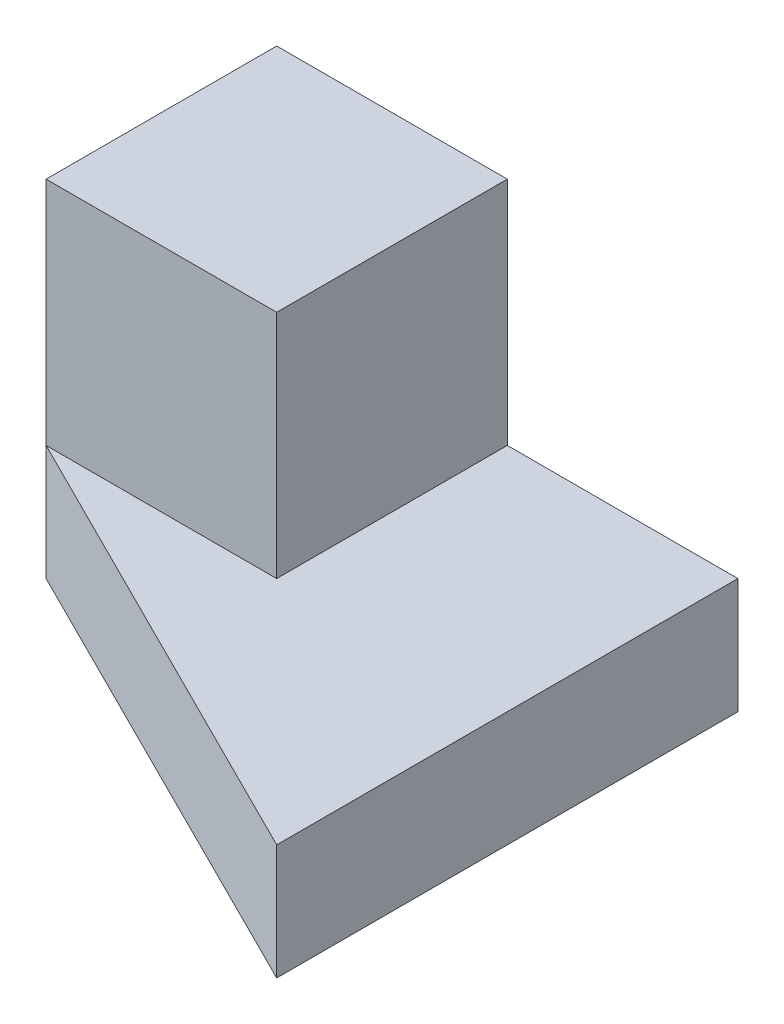
ISO-10303-21;
HEADER;
FILE_DESCRIPTION(('STEP AP214'),'2;1');
FILE_NAME('part.step','',(''),(''),'','','');
FILE_SCHEMA(('AUTOMOTIVE_DESIGN { 1 0 10303 214 1 1 1 1 }'));
ENDSEC;
DATA;
#1=APPLICATION_CONTEXT('core data for automotive mechanical design processes');
#2=APPLICATION_PROTOCOL_DEFINITION('international standard','automotive_design',2000,#1);
#3=PRODUCT_CONTEXT('',#1,'mechanical');
#4=PRODUCT('Part','Part','',(#3));
#5=PRODUCT_RELATED_PRODUCT_CATEGORY('part','',(#4));
#6=PRODUCT_DEFINITION_FORMATION('','',#4);
#7=PRODUCT_DEFINITION_CONTEXT('part definition',#1,'design');
#8=PRODUCT_DEFINITION('design','',#6,#7);
#9=PRODUCT_DEFINITION_SHAPE('','',#8);
#10=(LENGTH_UNIT() NAMED_UNIT(*) SI_UNIT(.MILLI.,.METRE.));
#11=(NAMED_UNIT(*) PLANE_ANGLE_UNIT() SI_UNIT($,.RADIAN.));
#12=(NAMED_UNIT(*) SI_UNIT($,.STERADIAN.) SOLID_ANGLE_UNIT());
#13=UNCERTAINTY_MEASURE_WITH_UNIT(LENGTH_MEASURE(1.E-05),#10,'distance_accuracy_value','');
#14=(GEOMETRIC_REPRESENTATION_CONTEXT(3) GLOBAL_UNCERTAINTY_ASSIGNED_CONTEXT((#13)) GLOBAL_UNIT_ASSIGNED_CONTEXT((#10,
#11,#12)) REPRESENTATION_CONTEXT('',''));
#15=CARTESIAN_POINT('',(0.,0.,0.));
#16=DIRECTION('',(0.,0.,1.));
#17=DIRECTION('',(1.,0.,0.));
#18=AXIS2_PLACEMENT_3D('',#15,#16,#17);
#19=CARTESIAN_POINT('',(0.,5.,0.));
#20=DIRECTION('',(1.,0.,0.));
#21=DIRECTION('',(0.,0.,-1.));
#22=AXIS2_PLACEMENT_3D('',#19,#20,#21);
#23=PLANE('',#22);
#24=DIRECTION('',(0.,0.,1.));
#25=VECTOR('',#24,1.);
#26=CARTESIAN_POINT('',(0.,0.,0.));
#27=LINE('',#26,#25);
#28=CARTESIAN_POINT('',(0.,0.,0.));
#29=VERTEX_POINT('',#28);
#30=CARTESIAN_POINT('',(0.,0.,10.));
#31=VERTEX_POINT('',#30);
#32=EDGE_CURVE('E117',#29,#31,#27,.T.);
#33=ORIENTED_EDGE('',*,*,#32,.T.);
#34=DIRECTION('',(0.,-1.,0.));
#35=VECTOR('',#34,1.);
#36=CARTESIAN_POINT('',(0.,5.,10.));
#37=LINE('',#36,#35);
#38=CARTESIAN_POINT('',(0.,5.,10.));
#39=VERTEX_POINT('',#38);
#40=EDGE_CURVE('E11',#39,#31,#37,.T.);
#41=ORIENTED_EDGE('',*,*,#40,.F.);
#42=DIRECTION('',(0.,-1.,0.));
#43=VECTOR('',#42,1.);
#44=CARTESIAN_POINT('',(0.,15.,10.));
#45=LINE('',#44,#43);
#46=CARTESIAN_POINT('',(0.,15.,10.));
#47=VERTEX_POINT('',#46);
#48=EDGE_CURVE('E99',#47,#39,#45,.T.);
#49=ORIENTED_EDGE('',*,*,#48,.F.);
#50=DIRECTION('',(0.,0.,1.));
#51=VECTOR('',#50,1.);
#52=CARTESIAN_POINT('',(0.,15.,0.));
#53=LINE('',#52,#51);
#54=CARTESIAN_POINT('',(0.,15.,0.));
#55=VERTEX_POINT('',#54);
#56=EDGE_CURVE('E105',#55,#47,#53,.T.);
#57=ORIENTED_EDGE('',*,*,#56,.F.);
#58=DIRECTION('',(0.,-1.,0.));
#59=VECTOR('',#58,1.);
#60=CARTESIAN_POINT('',(0.,5.,0.));
#61=LINE('',#60,#59);
#62=EDGE_CURVE('E128',#55,#29,#61,.T.);
#63=ORIENTED_EDGE('',*,*,#62,.T.);
#64=EDGE_LOOP('',(#33,#41,#49,#57,#63));
#65=FACE_BOUND('',#64,.T.);
#66=ADVANCED_FACE('F33',(#65),#23,.F.);
#67=CARTESIAN_POINT('',(0.,5.,10.));
#68=DIRECTION('',(0.447213595499958,0.,-0.894427190999916));
#69=DIRECTION('',(-0.894427190999916,0.,-0.447213595499958));
#70=AXIS2_PLACEMENT_3D('',#67,#68,#69);
#71=PLANE('',#70);
#72=DIRECTION('',(0.894427190999916,0.,0.447213595499958));
#73=VECTOR('',#72,1.);
#74=CARTESIAN_POINT('',(0.,0.,10.));
#75=LINE('',#74,#73);
#76=CARTESIAN_POINT('',(20.,0.,20.));
#77=VERTEX_POINT('',#76);
#78=EDGE_CURVE('E119',#31,#77,#75,.T.);
#79=ORIENTED_EDGE('',*,*,#78,.T.);
#80=DIRECTION('',(0.,-1.,0.));
#81=VECTOR('',#80,1.);
#82=CARTESIAN_POINT('',(20.,5.,20.));
#83=LINE('',#82,#81);
#84=CARTESIAN_POINT('',(20.,5.,20.));
#85=VERTEX_POINT('',#84);
#86=EDGE_CURVE('E40',#85,#77,#83,.T.);
#87=ORIENTED_EDGE('',*,*,#86,.F.);
#88=DIRECTION('',(0.894427190999916,0.,0.447213595499958));
#89=VECTOR('',#88,1.);
#90=CARTESIAN_POINT('',(0.,5.,10.));
#91=LINE('',#90,#89);
#92=EDGE_CURVE('E125',#39,#85,#91,.T.);
#93=ORIENTED_EDGE('',*,*,#92,.F.);
#94=ORIENTED_EDGE('',*,*,#40,.T.);
#95=EDGE_LOOP('',(#79,#87,#93,#94));
#96=FACE_BOUND('',#95,.T.);
#97=ADVANCED_FACE('F165',(#96),#71,.F.);
#98=CARTESIAN_POINT('',(20.,5.,0.));
#99=DIRECTION('',(-1.,0.,0.));
#100=DIRECTION('',(0.,0.,1.));
#101=AXIS2_PLACEMENT_3D('',#98,#99,#100);
#102=PLANE('',#101);
#103=DIRECTION('',(0.,0.,-1.));
#104=VECTOR('',#103,1.);
#105=CARTESIAN_POINT('',(20.,0.,0.));
#106=LINE('',#105,#104);
#107=CARTESIAN_POINT('',(20.,0.,0.));
#108=VERTEX_POINT('',#107);
#109=EDGE_CURVE('E131',#77,#108,#106,.T.);
#110=ORIENTED_EDGE('',*,*,#109,.T.);
#111=DIRECTION('',(0.,-1.,0.));
#112=VECTOR('',#111,1.);
#113=CARTESIAN_POINT('',(20.,5.,0.));
#114=LINE('',#113,#112);
#115=CARTESIAN_POINT('',(20.,5.,0.));
#116=VERTEX_POINT('',#115);
#117=EDGE_CURVE('E135',#116,#108,#114,.T.);
#118=ORIENTED_EDGE('',*,*,#117,.F.);
#119=DIRECTION('',(0.,0.,-1.));
#120=VECTOR('',#119,1.);
#121=CARTESIAN_POINT('',(20.,5.,0.));
#122=LINE('',#121,#120);
#123=EDGE_CURVE('E53',#85,#116,#122,.T.);
#124=ORIENTED_EDGE('',*,*,#123,.F.);
#125=ORIENTED_EDGE('',*,*,#86,.T.);
#126=EDGE_LOOP('',(#110,#118,#124,#125));
#127=FACE_BOUND('',#126,.T.);
#128=ADVANCED_FACE('F140',(#127),#102,.F.);
#129=CARTESIAN_POINT('',(0.,5.,0.));
#130=DIRECTION('',(0.,0.,1.));
#131=DIRECTION('',(1.,0.,0.));
#132=AXIS2_PLACEMENT_3D('',#129,#130,#131);
#133=PLANE('',#132);
#134=DIRECTION('',(-1.,0.,0.));
#135=VECTOR('',#134,1.);
#136=CARTESIAN_POINT('',(0.,0.,0.));
#137=LINE('',#136,#135);
#138=EDGE_CURVE('E74',#108,#29,#137,.T.);
#139=ORIENTED_EDGE('',*,*,#138,.T.);
#140=ORIENTED_EDGE('',*,*,#62,.F.);
#141=DIRECTION('',(-1.,0.,0.));
#142=VECTOR('',#141,1.);
#143=CARTESIAN_POINT('',(0.,15.,0.));
#144=LINE('',#143,#142);
#145=CARTESIAN_POINT('',(10.,15.,0.));
#146=VERTEX_POINT('',#145);
#147=EDGE_CURVE('E111',#146,#55,#144,.T.);
#148=ORIENTED_EDGE('',*,*,#147,.F.);
#149=DIRECTION('',(0.,-1.,0.));
#150=VECTOR('',#149,1.);
#151=CARTESIAN_POINT('',(10.,15.,0.));
#152=LINE('',#151,#150);
#153=CARTESIAN_POINT('',(10.,5.,0.));
#154=VERTEX_POINT('',#153);
#155=EDGE_CURVE('E121',#146,#154,#152,.T.);
#156=ORIENTED_EDGE('',*,*,#155,.T.);
#157=DIRECTION('',(-1.,0.,0.));
#158=VECTOR('',#157,1.);
#159=CARTESIAN_POINT('',(0.,5.,0.));
#160=LINE('',#159,#158);
#161=EDGE_CURVE('E47',#116,#154,#160,.T.);
#162=ORIENTED_EDGE('',*,*,#161,.F.);
#163=ORIENTED_EDGE('',*,*,#117,.T.);
#164=EDGE_LOOP('',(#139,#140,#148,#156,#162,#163));
#165=FACE_BOUND('',#164,.T.);
#166=ADVANCED_FACE('F145',(#165),#133,.F.);
#167=CARTESIAN_POINT('',(0.,5.,0.));
#168=DIRECTION('',(0.,1.,0.));
#169=DIRECTION('',(0.,0.,1.));
#170=AXIS2_PLACEMENT_3D('',#167,#168,#169);
#171=PLANE('',#170);
#172=DIRECTION('',(0.,0.,-1.));
#173=VECTOR('',#172,1.);
#174=CARTESIAN_POINT('',(10.,5.,0.));
#175=LINE('',#174,#173);
#176=CARTESIAN_POINT('',(10.,5.,10.));
#177=VERTEX_POINT('',#176);
#178=EDGE_CURVE('E113',#177,#154,#175,.T.);
#179=ORIENTED_EDGE('',*,*,#178,.F.);
#180=DIRECTION('',(1.,0.,0.));
#181=VECTOR('',#180,1.);
#182=CARTESIAN_POINT('',(0.,5.,10.));
#183=LINE('',#182,#181);
#184=EDGE_CURVE('E78',#39,#177,#183,.T.);
#185=ORIENTED_EDGE('',*,*,#184,.F.);
#186=ORIENTED_EDGE('',*,*,#92,.T.);
#187=ORIENTED_EDGE('',*,*,#123,.T.);
#188=ORIENTED_EDGE('',*,*,#161,.T.);
#189=EDGE_LOOP('',(#179,#185,#186,#187,#188));
#190=FACE_BOUND('',#189,.T.);
#191=ADVANCED_FACE('F154',(#190),#171,.T.);
#192=CARTESIAN_POINT('',(0.,0.,0.));
#193=DIRECTION('',(0.,1.,0.));
#194=DIRECTION('',(0.,0.,1.));
#195=AXIS2_PLACEMENT_3D('',#192,#193,#194);
#196=PLANE('',#195);
#197=ORIENTED_EDGE('',*,*,#32,.F.);
#198=ORIENTED_EDGE('',*,*,#138,.F.);
#199=ORIENTED_EDGE('',*,*,#109,.F.);
#200=ORIENTED_EDGE('',*,*,#78,.F.);
#201=EDGE_LOOP('',(#197,#198,#199,#200));
#202=FACE_BOUND('',#201,.T.);
#203=ADVANCED_FACE('F144',(#202),#196,.F.);
#204=CARTESIAN_POINT('',(0.,15.,10.));
#205=DIRECTION('',(0.,0.,-1.));
#206=DIRECTION('',(-1.,0.,0.));
#207=AXIS2_PLACEMENT_3D('',#204,#205,#206);
#208=PLANE('',#207);
#209=ORIENTED_EDGE('',*,*,#184,.T.);
#210=DIRECTION('',(0.,-1.,0.));
#211=VECTOR('',#210,1.);
#212=CARTESIAN_POINT('',(10.,15.,10.));
#213=LINE('',#212,#211);
#214=CARTESIAN_POINT('',(10.,15.,10.));
#215=VERTEX_POINT('',#214);
#216=EDGE_CURVE('E101',#215,#177,#213,.T.);
#217=ORIENTED_EDGE('',*,*,#216,.F.);
#218=DIRECTION('',(1.,0.,0.));
#219=VECTOR('',#218,1.);
#220=CARTESIAN_POINT('',(0.,15.,10.));
#221=LINE('',#220,#219);
#222=EDGE_CURVE('E95',#47,#215,#221,.T.);
#223=ORIENTED_EDGE('',*,*,#222,.F.);
#224=ORIENTED_EDGE('',*,*,#48,.T.);
#225=EDGE_LOOP('',(#209,#217,#223,#224));
#226=FACE_BOUND('',#225,.T.);
#227=ADVANCED_FACE('F97',(#226),#208,.F.);
#228=CARTESIAN_POINT('',(10.,15.,0.));
#229=DIRECTION('',(-1.,0.,0.));
#230=DIRECTION('',(0.,0.,1.));
#231=AXIS2_PLACEMENT_3D('',#228,#229,#230);
#232=PLANE('',#231);
#233=ORIENTED_EDGE('',*,*,#178,.T.);
#234=ORIENTED_EDGE('',*,*,#155,.F.);
#235=DIRECTION('',(0.,0.,-1.));
#236=VECTOR('',#235,1.);
#237=CARTESIAN_POINT('',(10.,15.,0.));
#238=LINE('',#237,#236);
#239=EDGE_CURVE('E104',#215,#146,#238,.T.);
#240=ORIENTED_EDGE('',*,*,#239,.F.);
#241=ORIENTED_EDGE('',*,*,#216,.T.);
#242=EDGE_LOOP('',(#233,#234,#240,#241));
#243=FACE_BOUND('',#242,.T.);
#244=ADVANCED_FACE('F153',(#243),#232,.F.);
#245=CARTESIAN_POINT('',(0.,15.,0.));
#246=DIRECTION('',(0.,1.,0.));
#247=DIRECTION('',(0.,0.,1.));
#248=AXIS2_PLACEMENT_3D('',#245,#246,#247);
#249=PLANE('',#248);
#250=ORIENTED_EDGE('',*,*,#56,.T.);
#251=ORIENTED_EDGE('',*,*,#222,.T.);
#252=ORIENTED_EDGE('',*,*,#239,.T.);
#253=ORIENTED_EDGE('',*,*,#147,.T.);
#254=EDGE_LOOP('',(#250,#251,#252,#253));
#255=FACE_BOUND('',#254,.T.);
#256=ADVANCED_FACE('F109',(#255),#249,.T.);
#257=CLOSED_SHELL('',(#66,#97,#128,#166,#191,#203,#227,#244,#256));
#258=MANIFOLD_SOLID_BREP('B2',#257);
#259=ADVANCED_BREP_SHAPE_REPRESENTATION('',(#18,#258),#14);
#260=SHAPE_DEFINITION_REPRESENTATION(#9,#259);
ENDSEC;
END-ISO-10303-21;
